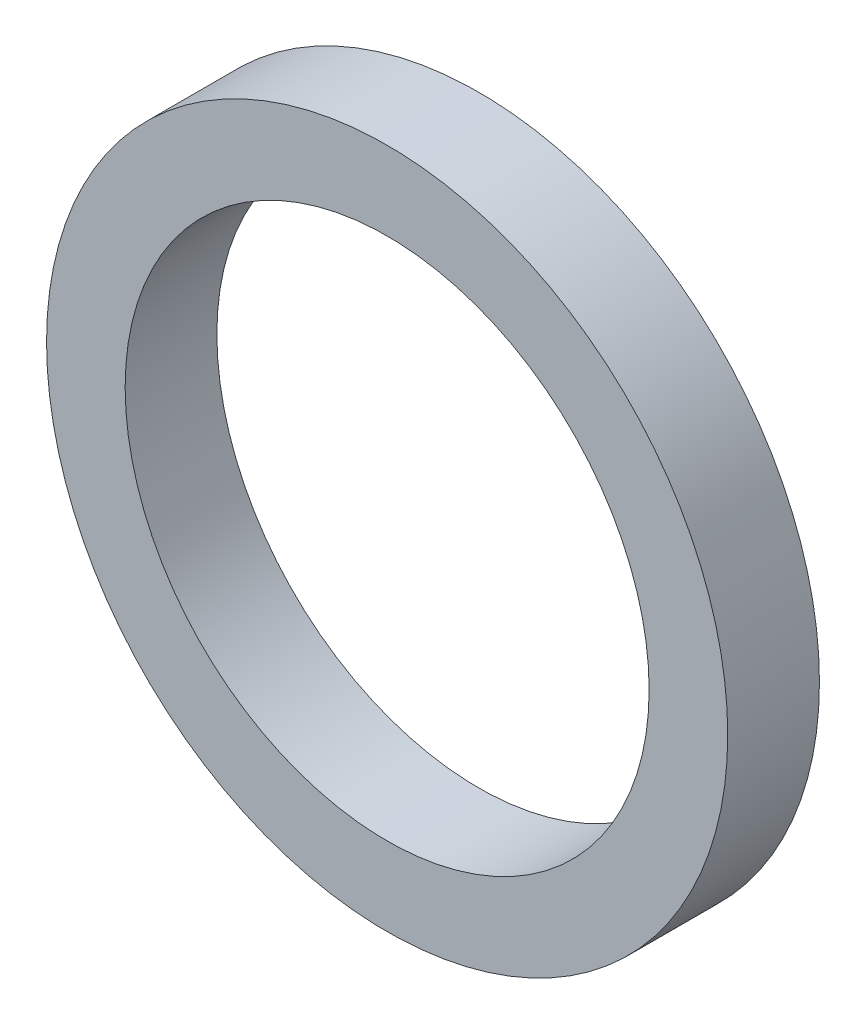
ISO-10303-21;
HEADER;
FILE_DESCRIPTION(('STEP AP214'),'2;1');
FILE_NAME('part.step','',(''),(''),'','','');
FILE_SCHEMA(('AUTOMOTIVE_DESIGN { 1 0 10303 214 1 1 1 1 }'));
ENDSEC;
DATA;
#1=APPLICATION_CONTEXT('core data for automotive mechanical design processes');
#2=APPLICATION_PROTOCOL_DEFINITION('international standard','automotive_design',2000,#1);
#3=PRODUCT_CONTEXT('',#1,'mechanical');
#4=PRODUCT('Part','Part','',(#3));
#5=PRODUCT_RELATED_PRODUCT_CATEGORY('part','',(#4));
#6=PRODUCT_DEFINITION_FORMATION('','',#4);
#7=PRODUCT_DEFINITION_CONTEXT('part definition',#1,'design');
#8=PRODUCT_DEFINITION('design','',#6,#7);
#9=PRODUCT_DEFINITION_SHAPE('','',#8);
#10=(LENGTH_UNIT() NAMED_UNIT(*) SI_UNIT(.MILLI.,.METRE.));
#11=(NAMED_UNIT(*) PLANE_ANGLE_UNIT() SI_UNIT($,.RADIAN.));
#12=(NAMED_UNIT(*) SI_UNIT($,.STERADIAN.) SOLID_ANGLE_UNIT());
#13=UNCERTAINTY_MEASURE_WITH_UNIT(LENGTH_MEASURE(1.E-05),#10,'distance_accuracy_value','');
#14=(GEOMETRIC_REPRESENTATION_CONTEXT(3) GLOBAL_UNCERTAINTY_ASSIGNED_CONTEXT((#13)) GLOBAL_UNIT_ASSIGNED_CONTEXT((#10,
#11,#12)) REPRESENTATION_CONTEXT('',''));
#15=CARTESIAN_POINT('',(0.,0.,0.));
#16=DIRECTION('',(0.,0.,1.));
#17=DIRECTION('',(1.,0.,0.));
#18=AXIS2_PLACEMENT_3D('',#15,#16,#17);
#19=CARTESIAN_POINT('',(0.,0.,7.));
#20=DIRECTION('',(0.,0.,1.));
#21=DIRECTION('',(1.,0.,0.));
#22=AXIS2_PLACEMENT_3D('',#19,#20,#21);
#23=PLANE('',#22);
#24=CARTESIAN_POINT('',(0.,0.,7.));
#25=DIRECTION('',(0.,0.,1.));
#26=DIRECTION('',(1.,0.,0.));
#27=AXIS2_PLACEMENT_3D('',#24,#25,#26);
#28=CIRCLE('',#27,26.);
#29=CARTESIAN_POINT('',(26.,0.,7.));
#30=VERTEX_POINT('',#29);
#31=EDGE_CURVE('E10',#30,#30,#28,.T.);
#32=ORIENTED_EDGE('',*,*,#31,.T.);
#33=EDGE_LOOP('',(#32));
#34=FACE_BOUND('',#33,.T.);
#35=CARTESIAN_POINT('',(0.,0.,7.));
#36=DIRECTION('',(0.,0.,1.));
#37=DIRECTION('',(1.,0.,0.));
#38=AXIS2_PLACEMENT_3D('',#35,#36,#37);
#39=CIRCLE('',#38,20.);
#40=CARTESIAN_POINT('',(20.,0.,7.));
#41=VERTEX_POINT('',#40);
#42=EDGE_CURVE('E50',#41,#41,#39,.T.);
#43=ORIENTED_EDGE('',*,*,#42,.F.);
#44=EDGE_LOOP('',(#43));
#45=FACE_BOUND('',#44,.T.);
#46=ADVANCED_FACE('F39',(#34,#45),#23,.T.);
#47=CARTESIAN_POINT('',(0.,0.,0.));
#48=DIRECTION('',(0.,0.,1.));
#49=DIRECTION('',(1.,0.,0.));
#50=AXIS2_PLACEMENT_3D('',#47,#48,#49);
#51=PLANE('',#50);
#52=CARTESIAN_POINT('',(0.,0.,0.));
#53=DIRECTION('',(0.,0.,1.));
#54=DIRECTION('',(1.,0.,0.));
#55=AXIS2_PLACEMENT_3D('',#52,#53,#54);
#56=CIRCLE('',#55,26.);
#57=CARTESIAN_POINT('',(26.,0.,0.));
#58=VERTEX_POINT('',#57);
#59=EDGE_CURVE('E43',#58,#58,#56,.T.);
#60=ORIENTED_EDGE('',*,*,#59,.F.);
#61=EDGE_LOOP('',(#60));
#62=FACE_BOUND('',#61,.T.);
#63=CARTESIAN_POINT('',(0.,0.,0.));
#64=DIRECTION('',(0.,0.,1.));
#65=DIRECTION('',(1.,0.,0.));
#66=AXIS2_PLACEMENT_3D('',#63,#64,#65);
#67=CIRCLE('',#66,20.);
#68=CARTESIAN_POINT('',(20.,0.,0.));
#69=VERTEX_POINT('',#68);
#70=EDGE_CURVE('E52',#69,#69,#67,.T.);
#71=ORIENTED_EDGE('',*,*,#70,.T.);
#72=EDGE_LOOP('',(#71));
#73=FACE_BOUND('',#72,.T.);
#74=ADVANCED_FACE('F62',(#62,#73),#51,.F.);
#75=CARTESIAN_POINT('',(0.,0.,7.));
#76=DIRECTION('',(0.,0.,-1.));
#77=DIRECTION('',(-1.,0.,0.));
#78=AXIS2_PLACEMENT_3D('',#75,#76,#77);
#79=CYLINDRICAL_SURFACE('',#78,26.);
#80=ORIENTED_EDGE('',*,*,#31,.F.);
#81=EDGE_LOOP('',(#80));
#82=FACE_BOUND('',#81,.T.);
#83=ORIENTED_EDGE('',*,*,#59,.T.);
#84=EDGE_LOOP('',(#83));
#85=FACE_BOUND('',#84,.T.);
#86=ADVANCED_FACE('F41',(#82,#85),#79,.T.);
#87=CARTESIAN_POINT('',(0.,0.,7.));
#88=DIRECTION('',(0.,0.,-1.));
#89=DIRECTION('',(-1.,0.,0.));
#90=AXIS2_PLACEMENT_3D('',#87,#88,#89);
#91=CYLINDRICAL_SURFACE('',#90,20.);
#92=ORIENTED_EDGE('',*,*,#42,.T.);
#93=EDGE_LOOP('',(#92));
#94=FACE_BOUND('',#93,.T.);
#95=ORIENTED_EDGE('',*,*,#70,.F.);
#96=EDGE_LOOP('',(#95));
#97=FACE_BOUND('',#96,.T.);
#98=ADVANCED_FACE('F58',(#94,#97),#91,.F.);
#99=CLOSED_SHELL('',(#46,#74,#86,#98));
#100=MANIFOLD_SOLID_BREP('B2',#99);
#101=ADVANCED_BREP_SHAPE_REPRESENTATION('',(#18,#100),#14);
#102=SHAPE_DEFINITION_REPRESENTATION(#9,#101);
ENDSEC;
END-ISO-10303-21;
